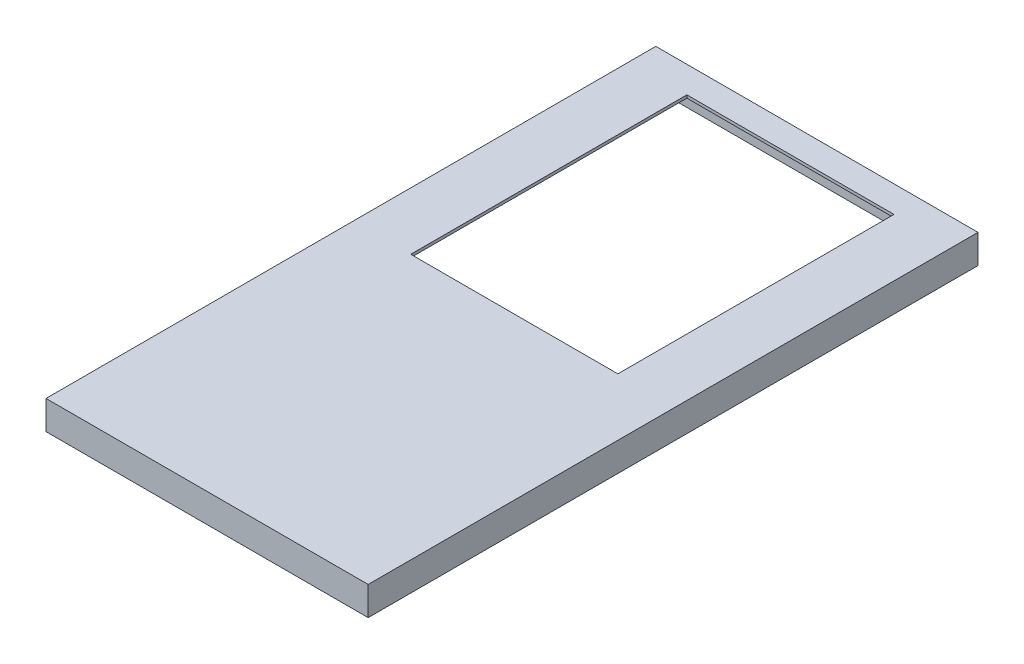
ISO-10303-21;
HEADER;
FILE_DESCRIPTION(('STEP AP214'),'2;1');
FILE_NAME('part.step','',(''),(''),'','','');
FILE_SCHEMA(('AUTOMOTIVE_DESIGN { 1 0 10303 214 1 1 1 1 }'));
ENDSEC;
DATA;
#1=APPLICATION_CONTEXT('core data for automotive mechanical design processes');
#2=APPLICATION_PROTOCOL_DEFINITION('international standard','automotive_design',2000,#1);
#3=PRODUCT_CONTEXT('',#1,'mechanical');
#4=PRODUCT('Part','Part','',(#3));
#5=PRODUCT_RELATED_PRODUCT_CATEGORY('part','',(#4));
#6=PRODUCT_DEFINITION_FORMATION('','',#4);
#7=PRODUCT_DEFINITION_CONTEXT('part definition',#1,'design');
#8=PRODUCT_DEFINITION('design','',#6,#7);
#9=PRODUCT_DEFINITION_SHAPE('','',#8);
#10=(LENGTH_UNIT() NAMED_UNIT(*) SI_UNIT(.MILLI.,.METRE.));
#11=(NAMED_UNIT(*) PLANE_ANGLE_UNIT() SI_UNIT($,.RADIAN.));
#12=(NAMED_UNIT(*) SI_UNIT($,.STERADIAN.) SOLID_ANGLE_UNIT());
#13=UNCERTAINTY_MEASURE_WITH_UNIT(LENGTH_MEASURE(1.E-05),#10,'distance_accuracy_value','');
#14=(GEOMETRIC_REPRESENTATION_CONTEXT(3) GLOBAL_UNCERTAINTY_ASSIGNED_CONTEXT((#13)) GLOBAL_UNIT_ASSIGNED_CONTEXT((#10,
#11,#12)) REPRESENTATION_CONTEXT('',''));
#15=CARTESIAN_POINT('',(0.,0.,0.));
#16=DIRECTION('',(0.,0.,1.));
#17=DIRECTION('',(1.,0.,0.));
#18=AXIS2_PLACEMENT_3D('',#15,#16,#17);
#19=CARTESIAN_POINT('',(-28.,-5.,51.5));
#20=DIRECTION('',(0.,0.,1.));
#21=DIRECTION('',(1.,0.,0.));
#22=AXIS2_PLACEMENT_3D('',#19,#20,#21);
#23=PLANE('',#22);
#24=DIRECTION('',(0.,1.,0.));
#25=VECTOR('',#24,1.);
#26=CARTESIAN_POINT('',(-22.8005102572168,-5.,51.5));
#27=LINE('',#26,#25);
#28=CARTESIAN_POINT('',(-22.8005102572168,-0.5,51.5));
#29=VERTEX_POINT('',#28);
#30=CARTESIAN_POINT('',(-22.8005102572168,-5.,51.5));
#31=VERTEX_POINT('',#30);
#32=EDGE_CURVE('E350',#29,#31,#27,.F.);
#33=ORIENTED_EDGE('',*,*,#32,.F.);
#34=DIRECTION('',(1.,0.,0.));
#35=VECTOR('',#34,1.);
#36=CARTESIAN_POINT('',(-28.,-0.5,51.5));
#37=LINE('',#36,#35);
#38=CARTESIAN_POINT('',(22.8005102572168,-0.5,51.5));
#39=VERTEX_POINT('',#38);
#40=EDGE_CURVE('E252',#29,#39,#37,.T.);
#41=ORIENTED_EDGE('',*,*,#40,.T.);
#42=DIRECTION('',(0.,1.,0.));
#43=VECTOR('',#42,1.);
#44=CARTESIAN_POINT('',(22.8005102572168,-5.,51.5));
#45=LINE('',#44,#43);
#46=CARTESIAN_POINT('',(22.8005102572168,-5.,51.5));
#47=VERTEX_POINT('',#46);
#48=EDGE_CURVE('E340',#39,#47,#45,.F.);
#49=ORIENTED_EDGE('',*,*,#48,.T.);
#50=DIRECTION('',(1.,0.,0.));
#51=VECTOR('',#50,1.);
#52=CARTESIAN_POINT('',(-28.,-5.,51.5));
#53=LINE('',#52,#51);
#54=EDGE_CURVE('E267',#31,#47,#53,.T.);
#55=ORIENTED_EDGE('',*,*,#54,.F.);
#56=EDGE_LOOP('',(#33,#41,#49,#55));
#57=FACE_BOUND('',#56,.T.);
#58=ADVANCED_FACE('F39',(#57),#23,.F.);
#59=CARTESIAN_POINT('',(-26.5,-5.,53.));
#60=DIRECTION('',(-1.,0.,0.));
#61=DIRECTION('',(0.,0.,1.));
#62=AXIS2_PLACEMENT_3D('',#59,#60,#61);
#63=PLANE('',#62);
#64=DIRECTION('',(0.,0.,1.));
#65=VECTOR('',#64,1.);
#66=CARTESIAN_POINT('',(-26.5,-5.,53.));
#67=LINE('',#66,#65);
#68=CARTESIAN_POINT('',(-26.5,-5.,-47.8005102572168));
#69=VERTEX_POINT('',#68);
#70=CARTESIAN_POINT('',(-26.5,-5.,47.8005102572168));
#71=VERTEX_POINT('',#70);
#72=EDGE_CURVE('E241',#69,#71,#67,.T.);
#73=ORIENTED_EDGE('',*,*,#72,.F.);
#74=DIRECTION('',(0.,1.,0.));
#75=VECTOR('',#74,1.);
#76=CARTESIAN_POINT('',(-26.5,-5.,-47.8005102572168));
#77=LINE('',#76,#75);
#78=CARTESIAN_POINT('',(-26.5,-0.5,-47.8005102572168));
#79=VERTEX_POINT('',#78);
#80=EDGE_CURVE('E225',#69,#79,#77,.T.);
#81=ORIENTED_EDGE('',*,*,#80,.T.);
#82=DIRECTION('',(0.,0.,1.));
#83=VECTOR('',#82,1.);
#84=CARTESIAN_POINT('',(-26.5,-0.5,53.));
#85=LINE('',#84,#83);
#86=CARTESIAN_POINT('',(-26.5,-0.5,47.8005102572168));
#87=VERTEX_POINT('',#86);
#88=EDGE_CURVE('E239',#79,#87,#85,.T.);
#89=ORIENTED_EDGE('',*,*,#88,.T.);
#90=DIRECTION('',(0.,1.,0.));
#91=VECTOR('',#90,1.);
#92=CARTESIAN_POINT('',(-26.5,-5.,47.8005102572168));
#93=LINE('',#92,#91);
#94=EDGE_CURVE('E48',#71,#87,#93,.T.);
#95=ORIENTED_EDGE('',*,*,#94,.F.);
#96=EDGE_LOOP('',(#73,#81,#89,#95));
#97=FACE_BOUND('',#96,.T.);
#98=ADVANCED_FACE('F237',(#97),#63,.F.);
#99=CARTESIAN_POINT('',(-28.,-5.,-51.5));
#100=DIRECTION('',(0.,0.,-1.));
#101=DIRECTION('',(-1.,0.,0.));
#102=AXIS2_PLACEMENT_3D('',#99,#100,#101);
#103=PLANE('',#102);
#104=DIRECTION('',(-1.,0.,0.));
#105=VECTOR('',#104,1.);
#106=CARTESIAN_POINT('',(-28.,-2.8,-51.5));
#107=LINE('',#106,#105);
#108=CARTESIAN_POINT('',(-21.6,-2.8,-51.5));
#109=VERTEX_POINT('',#108);
#110=CARTESIAN_POINT('',(-22.8005102572168,-2.8,-51.5));
#111=VERTEX_POINT('',#110);
#112=EDGE_CURVE('E332',#109,#111,#107,.T.);
#113=ORIENTED_EDGE('',*,*,#112,.T.);
#114=DIRECTION('',(0.,1.,0.));
#115=VECTOR('',#114,1.);
#116=CARTESIAN_POINT('',(-22.8005102572168,-5.,-51.5));
#117=LINE('',#116,#115);
#118=CARTESIAN_POINT('',(-22.8005102572168,-5.,-51.5));
#119=VERTEX_POINT('',#118);
#120=EDGE_CURVE('E244',#111,#119,#117,.F.);
#121=ORIENTED_EDGE('',*,*,#120,.T.);
#122=DIRECTION('',(-1.,0.,0.));
#123=VECTOR('',#122,1.);
#124=CARTESIAN_POINT('',(-28.,-5.,-51.5));
#125=LINE('',#124,#123);
#126=CARTESIAN_POINT('',(22.8005102572168,-5.,-51.5));
#127=VERTEX_POINT('',#126);
#128=EDGE_CURVE('E266',#127,#119,#125,.T.);
#129=ORIENTED_EDGE('',*,*,#128,.F.);
#130=DIRECTION('',(0.,1.,0.));
#131=VECTOR('',#130,1.);
#132=CARTESIAN_POINT('',(22.8005102572168,-5.,-51.5));
#133=LINE('',#132,#131);
#134=CARTESIAN_POINT('',(22.8005102572168,-2.8,-51.5));
#135=VERTEX_POINT('',#134);
#136=EDGE_CURVE('E400',#135,#127,#133,.F.);
#137=ORIENTED_EDGE('',*,*,#136,.F.);
#138=CARTESIAN_POINT('',(21.6,-2.8,-51.5));
#139=VERTEX_POINT('',#138);
#140=EDGE_CURVE('E336',#135,#139,#107,.T.);
#141=ORIENTED_EDGE('',*,*,#140,.T.);
#142=DIRECTION('',(0.,1.,0.));
#143=VECTOR('',#142,1.);
#144=CARTESIAN_POINT('',(21.6,-2.8,-51.5));
#145=LINE('',#144,#143);
#146=CARTESIAN_POINT('',(21.6,-0.5,-51.5));
#147=VERTEX_POINT('',#146);
#148=EDGE_CURVE('E499',#139,#147,#145,.T.);
#149=ORIENTED_EDGE('',*,*,#148,.T.);
#150=DIRECTION('',(-1.,0.,0.));
#151=VECTOR('',#150,1.);
#152=CARTESIAN_POINT('',(-28.,-0.5,-51.5));
#153=LINE('',#152,#151);
#154=CARTESIAN_POINT('',(-21.6,-0.5,-51.5));
#155=VERTEX_POINT('',#154);
#156=EDGE_CURVE('E253',#147,#155,#153,.T.);
#157=ORIENTED_EDGE('',*,*,#156,.T.);
#158=DIRECTION('',(0.,1.,0.));
#159=VECTOR('',#158,1.);
#160=CARTESIAN_POINT('',(-21.6,-2.8,-51.5));
#161=LINE('',#160,#159);
#162=EDGE_CURVE('E496',#109,#155,#161,.T.);
#163=ORIENTED_EDGE('',*,*,#162,.F.);
#164=EDGE_LOOP('',(#113,#121,#129,#137,#141,#149,#157,#163));
#165=FACE_BOUND('',#164,.T.);
#166=ADVANCED_FACE('F560',(#165),#103,.F.);
#167=CARTESIAN_POINT('',(26.5,-5.,53.));
#168=DIRECTION('',(1.,0.,0.));
#169=DIRECTION('',(0.,0.,-1.));
#170=AXIS2_PLACEMENT_3D('',#167,#168,#169);
#171=PLANE('',#170);
#172=DIRECTION('',(0.,0.,-1.));
#173=VECTOR('',#172,1.);
#174=CARTESIAN_POINT('',(26.5,-5.,53.));
#175=LINE('',#174,#173);
#176=CARTESIAN_POINT('',(26.5,-5.,47.8005102572168));
#177=VERTEX_POINT('',#176);
#178=CARTESIAN_POINT('',(26.5,-5.,-47.8005102572168));
#179=VERTEX_POINT('',#178);
#180=EDGE_CURVE('E257',#177,#179,#175,.T.);
#181=ORIENTED_EDGE('',*,*,#180,.F.);
#182=DIRECTION('',(0.,1.,0.));
#183=VECTOR('',#182,1.);
#184=CARTESIAN_POINT('',(26.5,-5.,47.8005102572168));
#185=LINE('',#184,#183);
#186=CARTESIAN_POINT('',(26.5,-0.5,47.8005102572168));
#187=VERTEX_POINT('',#186);
#188=EDGE_CURVE('E376',#177,#187,#185,.T.);
#189=ORIENTED_EDGE('',*,*,#188,.T.);
#190=DIRECTION('',(0.,0.,-1.));
#191=VECTOR('',#190,1.);
#192=CARTESIAN_POINT('',(26.5,-0.5,53.));
#193=LINE('',#192,#191);
#194=CARTESIAN_POINT('',(26.5,-0.5,-47.8005102572168));
#195=VERTEX_POINT('',#194);
#196=EDGE_CURVE('E260',#187,#195,#193,.T.);
#197=ORIENTED_EDGE('',*,*,#196,.T.);
#198=DIRECTION('',(0.,1.,0.));
#199=VECTOR('',#198,1.);
#200=CARTESIAN_POINT('',(26.5,-5.,-47.8005102572168));
#201=LINE('',#200,#199);
#202=EDGE_CURVE('E403',#179,#195,#201,.T.);
#203=ORIENTED_EDGE('',*,*,#202,.F.);
#204=EDGE_LOOP('',(#181,#189,#197,#203));
#205=FACE_BOUND('',#204,.T.);
#206=ADVANCED_FACE('F538',(#205),#171,.F.);
#207=CARTESIAN_POINT('',(23.1,-2.8,-53.));
#208=DIRECTION('',(-1.,0.,0.));
#209=DIRECTION('',(0.,0.,1.));
#210=AXIS2_PLACEMENT_3D('',#207,#208,#209);
#211=PLANE('',#210);
#212=DIRECTION('',(0.,1.,0.));
#213=VECTOR('',#212,1.);
#214=CARTESIAN_POINT('',(23.1,-5.,-48.5353571800518));
#215=LINE('',#214,#213);
#216=CARTESIAN_POINT('',(23.1,-0.5,-48.5353571800518));
#217=VERTEX_POINT('',#216);
#218=CARTESIAN_POINT('',(23.1,-2.8,-48.5353571800518));
#219=VERTEX_POINT('',#218);
#220=EDGE_CURVE('E62',#217,#219,#215,.F.);
#221=ORIENTED_EDGE('',*,*,#220,.F.);
#222=DIRECTION('',(0.,0.,-1.));
#223=VECTOR('',#222,1.);
#224=CARTESIAN_POINT('',(23.1,-0.5,0.));
#225=LINE('',#224,#223);
#226=CARTESIAN_POINT('',(23.1,-0.5,10.7));
#227=VERTEX_POINT('',#226);
#228=EDGE_CURVE('E328',#227,#217,#225,.T.);
#229=ORIENTED_EDGE('',*,*,#228,.F.);
#230=DIRECTION('',(0.,1.,0.));
#231=VECTOR('',#230,1.);
#232=CARTESIAN_POINT('',(23.1,-2.8,10.7));
#233=LINE('',#232,#231);
#234=CARTESIAN_POINT('',(23.1,-2.8,10.7));
#235=VERTEX_POINT('',#234);
#236=EDGE_CURVE('E477',#235,#227,#233,.T.);
#237=ORIENTED_EDGE('',*,*,#236,.F.);
#238=DIRECTION('',(0.,0.,1.));
#239=VECTOR('',#238,1.);
#240=CARTESIAN_POINT('',(23.1,-2.8,-53.));
#241=LINE('',#240,#239);
#242=EDGE_CURVE('E433',#219,#235,#241,.T.);
#243=ORIENTED_EDGE('',*,*,#242,.F.);
#244=EDGE_LOOP('',(#221,#229,#237,#243));
#245=FACE_BOUND('',#244,.T.);
#246=ADVANCED_FACE('F546',(#245),#211,.F.);
#247=CARTESIAN_POINT('',(0.,-0.5,0.));
#248=DIRECTION('',(0.,-1.,0.));
#249=DIRECTION('',(0.,0.,-1.));
#250=AXIS2_PLACEMENT_3D('',#247,#248,#249);
#251=PLANE('',#250);
#252=CARTESIAN_POINT('',(-25.25,-0.5,-50.25));
#253=DIRECTION('',(0.,1.,0.));
#254=DIRECTION('',(0.,0.,-1.));
#255=AXIS2_PLACEMENT_3D('',#252,#253,#254);
#256=CIRCLE('',#255,2.75);
#257=CARTESIAN_POINT('',(-23.1,-0.5,-48.5353571800518));
#258=VERTEX_POINT('',#257);
#259=EDGE_CURVE('E222',#79,#258,#256,.T.);
#260=ORIENTED_EDGE('',*,*,#259,.T.);
#261=DIRECTION('',(0.,0.,-1.));
#262=VECTOR('',#261,1.);
#263=CARTESIAN_POINT('',(-23.1,-0.5,-53.));
#264=LINE('',#263,#262);
#265=CARTESIAN_POINT('',(-23.1,-0.5,10.7));
#266=VERTEX_POINT('',#265);
#267=EDGE_CURVE('E462',#266,#258,#264,.T.);
#268=ORIENTED_EDGE('',*,*,#267,.F.);
#269=DIRECTION('',(-1.,0.,0.));
#270=VECTOR('',#269,1.);
#271=CARTESIAN_POINT('',(-23.1,-0.5,10.7));
#272=LINE('',#271,#270);
#273=CARTESIAN_POINT('',(-18.1,-0.5,10.7));
#274=VERTEX_POINT('',#273);
#275=EDGE_CURVE('E458',#274,#266,#272,.T.);
#276=ORIENTED_EDGE('',*,*,#275,.F.);
#277=DIRECTION('',(0.,0.,1.));
#278=VECTOR('',#277,1.);
#279=CARTESIAN_POINT('',(-18.1,-0.5,9.20000000000001));
#280=LINE('',#279,#278);
#281=CARTESIAN_POINT('',(-18.1,-0.5,9.20000000000001));
#282=VERTEX_POINT('',#281);
#283=EDGE_CURVE('E455',#282,#274,#280,.T.);
#284=ORIENTED_EDGE('',*,*,#283,.F.);
#285=DIRECTION('',(1.,0.,0.));
#286=VECTOR('',#285,1.);
#287=CARTESIAN_POINT('',(-21.6,-0.5,9.20000000000001));
#288=LINE('',#287,#286);
#289=CARTESIAN_POINT('',(-21.6,-0.5,9.20000000000001));
#290=VERTEX_POINT('',#289);
#291=EDGE_CURVE('E452',#290,#282,#288,.T.);
#292=ORIENTED_EDGE('',*,*,#291,.F.);
#293=DIRECTION('',(0.,0.,1.));
#294=VECTOR('',#293,1.);
#295=CARTESIAN_POINT('',(-21.6,-0.5,-51.5));
#296=LINE('',#295,#294);
#297=EDGE_CURVE('E449',#155,#290,#296,.T.);
#298=ORIENTED_EDGE('',*,*,#297,.F.);
#299=ORIENTED_EDGE('',*,*,#156,.F.);
#300=DIRECTION('',(0.,0.,-1.));
#301=VECTOR('',#300,1.);
#302=CARTESIAN_POINT('',(21.6,-0.5,-51.5));
#303=LINE('',#302,#301);
#304=CARTESIAN_POINT('',(21.6,-0.5,9.20000000000001));
#305=VERTEX_POINT('',#304);
#306=EDGE_CURVE('E446',#305,#147,#303,.T.);
#307=ORIENTED_EDGE('',*,*,#306,.F.);
#308=DIRECTION('',(1.,0.,0.));
#309=VECTOR('',#308,1.);
#310=CARTESIAN_POINT('',(18.1,-0.5,9.20000000000001));
#311=LINE('',#310,#309);
#312=CARTESIAN_POINT('',(18.1,-0.5,9.20000000000001));
#313=VERTEX_POINT('',#312);
#314=EDGE_CURVE('E407',#313,#305,#311,.T.);
#315=ORIENTED_EDGE('',*,*,#314,.F.);
#316=DIRECTION('',(0.,0.,-1.));
#317=VECTOR('',#316,1.);
#318=CARTESIAN_POINT('',(18.1,-0.5,10.7));
#319=LINE('',#318,#317);
#320=CARTESIAN_POINT('',(18.1,-0.5,10.7));
#321=VERTEX_POINT('',#320);
#322=EDGE_CURVE('E413',#321,#313,#319,.T.);
#323=ORIENTED_EDGE('',*,*,#322,.F.);
#324=DIRECTION('',(-1.,0.,0.));
#325=VECTOR('',#324,1.);
#326=CARTESIAN_POINT('',(18.1,-0.5,10.7));
#327=LINE('',#326,#325);
#328=EDGE_CURVE('E465',#227,#321,#327,.T.);
#329=ORIENTED_EDGE('',*,*,#328,.F.);
#330=ORIENTED_EDGE('',*,*,#228,.T.);
#331=CARTESIAN_POINT('',(25.25,-0.5,-50.25));
#332=DIRECTION('',(0.,-1.,0.));
#333=DIRECTION('',(0.,0.,-1.));
#334=AXIS2_PLACEMENT_3D('',#331,#332,#333);
#335=CIRCLE('',#334,2.75);
#336=EDGE_CURVE('E388',#195,#217,#335,.T.);
#337=ORIENTED_EDGE('',*,*,#336,.F.);
#338=ORIENTED_EDGE('',*,*,#196,.F.);
#339=CARTESIAN_POINT('',(25.25,-0.5,50.25));
#340=DIRECTION('',(0.,1.,0.));
#341=DIRECTION('',(0.,0.,1.));
#342=AXIS2_PLACEMENT_3D('',#339,#340,#341);
#343=CIRCLE('',#342,2.75);
#344=EDGE_CURVE('E368',#187,#39,#343,.T.);
#345=ORIENTED_EDGE('',*,*,#344,.T.);
#346=ORIENTED_EDGE('',*,*,#40,.F.);
#347=CARTESIAN_POINT('',(-25.25,-0.5,50.25));
#348=DIRECTION('',(0.,-1.,0.));
#349=DIRECTION('',(0.,0.,1.));
#350=AXIS2_PLACEMENT_3D('',#347,#348,#349);
#351=CIRCLE('',#350,2.75);
#352=EDGE_CURVE('E250',#87,#29,#351,.T.);
#353=ORIENTED_EDGE('',*,*,#352,.F.);
#354=ORIENTED_EDGE('',*,*,#88,.F.);
#355=EDGE_LOOP('',(#260,#268,#276,#284,#292,#298,#299,#307,#315,#323,#329,#330,#337,#338,#345,
#346,#353,#354));
#356=FACE_BOUND('',#355,.T.);
#357=DIRECTION('',(0.,0.,1.));
#358=VECTOR('',#357,1.);
#359=CARTESIAN_POINT('',(18.,-0.5,0.));
#360=LINE('',#359,#358);
#361=CARTESIAN_POINT('',(18.,-0.5,-48.4));
#362=VERTEX_POINT('',#361);
#363=CARTESIAN_POINT('',(18.,-0.5,-0.399999999999998));
#364=VERTEX_POINT('',#363);
#365=EDGE_CURVE('E325',#362,#364,#360,.T.);
#366=ORIENTED_EDGE('',*,*,#365,.F.);
#367=DIRECTION('',(1.,0.,0.));
#368=VECTOR('',#367,1.);
#369=CARTESIAN_POINT('',(0.,-0.5,-48.4));
#370=LINE('',#369,#368);
#371=CARTESIAN_POINT('',(-18.,-0.5,-48.4));
#372=VERTEX_POINT('',#371);
#373=EDGE_CURVE('E307',#372,#362,#370,.T.);
#374=ORIENTED_EDGE('',*,*,#373,.F.);
#375=DIRECTION('',(0.,0.,-1.));
#376=VECTOR('',#375,1.);
#377=CARTESIAN_POINT('',(-18.,-0.5,0.));
#378=LINE('',#377,#376);
#379=CARTESIAN_POINT('',(-18.,-0.5,-0.399999999999998));
#380=VERTEX_POINT('',#379);
#381=EDGE_CURVE('E318',#380,#372,#378,.T.);
#382=ORIENTED_EDGE('',*,*,#381,.F.);
#383=DIRECTION('',(-1.,0.,0.));
#384=VECTOR('',#383,1.);
#385=CARTESIAN_POINT('',(0.,-0.5,-0.399999999999998));
#386=LINE('',#385,#384);
#387=EDGE_CURVE('E322',#364,#380,#386,.T.);
#388=ORIENTED_EDGE('',*,*,#387,.F.);
#389=EDGE_LOOP('',(#366,#374,#382,#388));
#390=FACE_BOUND('',#389,.T.);
#391=ADVANCED_FACE('F247',(#356,#390),#251,.T.);
#392=CARTESIAN_POINT('',(0.,-5.,0.));
#393=DIRECTION('',(0.,-1.,0.));
#394=DIRECTION('',(0.,0.,-1.));
#395=AXIS2_PLACEMENT_3D('',#392,#393,#394);
#396=PLANE('',#395);
#397=CARTESIAN_POINT('',(-25.25,-5.,-50.25));
#398=DIRECTION('',(0.,1.,0.));
#399=DIRECTION('',(0.,0.,-1.));
#400=AXIS2_PLACEMENT_3D('',#397,#398,#399);
#401=CIRCLE('',#400,1.8);
#402=CARTESIAN_POINT('',(-25.25,-5.,-52.05));
#403=VERTEX_POINT('',#402);
#404=EDGE_CURVE('E1004',#403,#403,#401,.T.);
#405=ORIENTED_EDGE('',*,*,#404,.T.);
#406=EDGE_LOOP('',(#405));
#407=FACE_BOUND('',#406,.T.);
#408=CARTESIAN_POINT('',(-25.25,-5.,-50.25));
#409=DIRECTION('',(0.,1.,0.));
#410=DIRECTION('',(0.,0.,-1.));
#411=AXIS2_PLACEMENT_3D('',#408,#409,#410);
#412=CIRCLE('',#411,2.75);
#413=EDGE_CURVE('E232',#69,#119,#412,.T.);
#414=ORIENTED_EDGE('',*,*,#413,.F.);
#415=ORIENTED_EDGE('',*,*,#72,.T.);
#416=CARTESIAN_POINT('',(-25.25,-5.,50.25));
#417=DIRECTION('',(0.,-1.,0.));
#418=DIRECTION('',(0.,0.,1.));
#419=AXIS2_PLACEMENT_3D('',#416,#417,#418);
#420=CIRCLE('',#419,2.75);
#421=EDGE_CURVE('E349',#71,#31,#420,.T.);
#422=ORIENTED_EDGE('',*,*,#421,.T.);
#423=ORIENTED_EDGE('',*,*,#54,.T.);
#424=CARTESIAN_POINT('',(25.25,-5.,50.25));
#425=DIRECTION('',(0.,1.,0.));
#426=DIRECTION('',(0.,0.,1.));
#427=AXIS2_PLACEMENT_3D('',#424,#425,#426);
#428=CIRCLE('',#427,2.75);
#429=EDGE_CURVE('E372',#177,#47,#428,.T.);
#430=ORIENTED_EDGE('',*,*,#429,.F.);
#431=ORIENTED_EDGE('',*,*,#180,.T.);
#432=CARTESIAN_POINT('',(25.25,-5.,-50.25));
#433=DIRECTION('',(0.,-1.,0.));
#434=DIRECTION('',(0.,0.,-1.));
#435=AXIS2_PLACEMENT_3D('',#432,#433,#434);
#436=CIRCLE('',#435,2.75);
#437=EDGE_CURVE('E392',#179,#127,#436,.T.);
#438=ORIENTED_EDGE('',*,*,#437,.T.);
#439=ORIENTED_EDGE('',*,*,#128,.T.);
#440=EDGE_LOOP('',(#414,#415,#422,#423,#430,#431,#438,#439));
#441=FACE_BOUND('',#440,.T.);
#442=DIRECTION('',(0.,0.,1.));
#443=VECTOR('',#442,1.);
#444=CARTESIAN_POINT('',(-28.,-5.,53.));
#445=LINE('',#444,#443);
#446=CARTESIAN_POINT('',(-28.,-5.,-53.));
#447=VERTEX_POINT('',#446);
#448=CARTESIAN_POINT('',(-28.,-5.,53.));
#449=VERTEX_POINT('',#448);
#450=EDGE_CURVE('E283',#447,#449,#445,.T.);
#451=ORIENTED_EDGE('',*,*,#450,.F.);
#452=DIRECTION('',(-1.,0.,0.));
#453=VECTOR('',#452,1.);
#454=CARTESIAN_POINT('',(-28.,-5.,-53.));
#455=LINE('',#454,#453);
#456=CARTESIAN_POINT('',(28.,-5.,-53.));
#457=VERTEX_POINT('',#456);
#458=EDGE_CURVE('E279',#457,#447,#455,.T.);
#459=ORIENTED_EDGE('',*,*,#458,.F.);
#460=DIRECTION('',(0.,0.,-1.));
#461=VECTOR('',#460,1.);
#462=CARTESIAN_POINT('',(28.,-5.,53.));
#463=LINE('',#462,#461);
#464=CARTESIAN_POINT('',(28.,-5.,53.));
#465=VERTEX_POINT('',#464);
#466=EDGE_CURVE('E276',#465,#457,#463,.T.);
#467=ORIENTED_EDGE('',*,*,#466,.F.);
#468=DIRECTION('',(1.,0.,0.));
#469=VECTOR('',#468,1.);
#470=CARTESIAN_POINT('',(-28.,-5.,53.));
#471=LINE('',#470,#469);
#472=EDGE_CURVE('E286',#449,#465,#471,.T.);
#473=ORIENTED_EDGE('',*,*,#472,.F.);
#474=EDGE_LOOP('',(#451,#459,#467,#473));
#475=FACE_BOUND('',#474,.T.);
#476=CARTESIAN_POINT('',(-25.25,-5.,50.25));
#477=DIRECTION('',(0.,-1.,0.));
#478=DIRECTION('',(0.,0.,1.));
#479=AXIS2_PLACEMENT_3D('',#476,#477,#478);
#480=CIRCLE('',#479,1.8);
#481=CARTESIAN_POINT('',(-25.25,-5.,52.05));
#482=VERTEX_POINT('',#481);
#483=EDGE_CURVE('E243',#482,#482,#480,.T.);
#484=ORIENTED_EDGE('',*,*,#483,.F.);
#485=EDGE_LOOP('',(#484));
#486=FACE_BOUND('',#485,.T.);
#487=CARTESIAN_POINT('',(25.25,-5.,-50.25));
#488=DIRECTION('',(0.,-1.,0.));
#489=DIRECTION('',(0.,0.,-1.));
#490=AXIS2_PLACEMENT_3D('',#487,#488,#489);
#491=CIRCLE('',#490,1.8);
#492=CARTESIAN_POINT('',(25.25,-5.,-52.05));
#493=VERTEX_POINT('',#492);
#494=EDGE_CURVE('E383',#493,#493,#491,.T.);
#495=ORIENTED_EDGE('',*,*,#494,.F.);
#496=EDGE_LOOP('',(#495));
#497=FACE_BOUND('',#496,.T.);
#498=CARTESIAN_POINT('',(25.25,-5.,50.25));
#499=DIRECTION('',(0.,1.,0.));
#500=DIRECTION('',(0.,0.,1.));
#501=AXIS2_PLACEMENT_3D('',#498,#499,#500);
#502=CIRCLE('',#501,1.8);
#503=CARTESIAN_POINT('',(25.25,-5.,52.05));
#504=VERTEX_POINT('',#503);
#505=EDGE_CURVE('E357',#504,#504,#502,.T.);
#506=ORIENTED_EDGE('',*,*,#505,.T.);
#507=EDGE_LOOP('',(#506));
#508=FACE_BOUND('',#507,.T.);
#509=ADVANCED_FACE('F562',(#407,#441,#475,#486,#497,#508),#396,.T.);
#510=CARTESIAN_POINT('',(28.,-5.,53.));
#511=DIRECTION('',(1.,0.,0.));
#512=DIRECTION('',(0.,0.,-1.));
#513=AXIS2_PLACEMENT_3D('',#510,#511,#512);
#514=PLANE('',#513);
#515=ORIENTED_EDGE('',*,*,#466,.T.);
#516=DIRECTION('',(0.,1.,0.));
#517=VECTOR('',#516,1.);
#518=CARTESIAN_POINT('',(28.,-5.,-53.));
#519=LINE('',#518,#517);
#520=CARTESIAN_POINT('',(28.,0.,-53.));
#521=VERTEX_POINT('',#520);
#522=EDGE_CURVE('E289',#457,#521,#519,.T.);
#523=ORIENTED_EDGE('',*,*,#522,.T.);
#524=DIRECTION('',(0.,0.,-1.));
#525=VECTOR('',#524,1.);
#526=CARTESIAN_POINT('',(28.,0.,53.));
#527=LINE('',#526,#525);
#528=CARTESIAN_POINT('',(28.,0.,53.));
#529=VERTEX_POINT('',#528);
#530=EDGE_CURVE('E270',#529,#521,#527,.T.);
#531=ORIENTED_EDGE('',*,*,#530,.F.);
#532=DIRECTION('',(0.,1.,0.));
#533=VECTOR('',#532,1.);
#534=CARTESIAN_POINT('',(28.,-5.,53.));
#535=LINE('',#534,#533);
#536=EDGE_CURVE('E304',#465,#529,#535,.T.);
#537=ORIENTED_EDGE('',*,*,#536,.F.);
#538=EDGE_LOOP('',(#515,#523,#531,#537));
#539=FACE_BOUND('',#538,.T.);
#540=ADVANCED_FACE('F41',(#539),#514,.T.);
#541=CARTESIAN_POINT('',(-28.,-5.,53.));
#542=DIRECTION('',(0.,0.,1.));
#543=DIRECTION('',(1.,0.,0.));
#544=AXIS2_PLACEMENT_3D('',#541,#542,#543);
#545=PLANE('',#544);
#546=ORIENTED_EDGE('',*,*,#472,.T.);
#547=ORIENTED_EDGE('',*,*,#536,.T.);
#548=DIRECTION('',(1.,0.,0.));
#549=VECTOR('',#548,1.);
#550=CARTESIAN_POINT('',(-28.,0.,53.));
#551=LINE('',#550,#549);
#552=CARTESIAN_POINT('',(-28.,0.,53.));
#553=VERTEX_POINT('',#552);
#554=EDGE_CURVE('E280',#553,#529,#551,.T.);
#555=ORIENTED_EDGE('',*,*,#554,.F.);
#556=DIRECTION('',(0.,1.,0.));
#557=VECTOR('',#556,1.);
#558=CARTESIAN_POINT('',(-28.,-5.,53.));
#559=LINE('',#558,#557);
#560=EDGE_CURVE('E308',#449,#553,#559,.T.);
#561=ORIENTED_EDGE('',*,*,#560,.F.);
#562=EDGE_LOOP('',(#546,#547,#555,#561));
#563=FACE_BOUND('',#562,.T.);
#564=ADVANCED_FACE('F591',(#563),#545,.T.);
#565=CARTESIAN_POINT('',(-28.,-5.,53.));
#566=DIRECTION('',(-1.,0.,0.));
#567=DIRECTION('',(0.,0.,1.));
#568=AXIS2_PLACEMENT_3D('',#565,#566,#567);
#569=PLANE('',#568);
#570=ORIENTED_EDGE('',*,*,#450,.T.);
#571=ORIENTED_EDGE('',*,*,#560,.T.);
#572=DIRECTION('',(0.,0.,1.));
#573=VECTOR('',#572,1.);
#574=CARTESIAN_POINT('',(-28.,0.,53.));
#575=LINE('',#574,#573);
#576=CARTESIAN_POINT('',(-28.,0.,-53.));
#577=VERTEX_POINT('',#576);
#578=EDGE_CURVE('E297',#577,#553,#575,.T.);
#579=ORIENTED_EDGE('',*,*,#578,.F.);
#580=DIRECTION('',(0.,1.,0.));
#581=VECTOR('',#580,1.);
#582=CARTESIAN_POINT('',(-28.,-5.,-53.));
#583=LINE('',#582,#581);
#584=EDGE_CURVE('E311',#447,#577,#583,.T.);
#585=ORIENTED_EDGE('',*,*,#584,.F.);
#586=EDGE_LOOP('',(#570,#571,#579,#585));
#587=FACE_BOUND('',#586,.T.);
#588=ADVANCED_FACE('F594',(#587),#569,.T.);
#589=CARTESIAN_POINT('',(-28.,-5.,-53.));
#590=DIRECTION('',(0.,0.,-1.));
#591=DIRECTION('',(-1.,0.,0.));
#592=AXIS2_PLACEMENT_3D('',#589,#590,#591);
#593=PLANE('',#592);
#594=ORIENTED_EDGE('',*,*,#458,.T.);
#595=ORIENTED_EDGE('',*,*,#584,.T.);
#596=DIRECTION('',(-1.,0.,0.));
#597=VECTOR('',#596,1.);
#598=CARTESIAN_POINT('',(-28.,0.,-53.));
#599=LINE('',#598,#597);
#600=EDGE_CURVE('E293',#521,#577,#599,.T.);
#601=ORIENTED_EDGE('',*,*,#600,.F.);
#602=ORIENTED_EDGE('',*,*,#522,.F.);
#603=EDGE_LOOP('',(#594,#595,#601,#602));
#604=FACE_BOUND('',#603,.T.);
#605=ADVANCED_FACE('F589',(#604),#593,.T.);
#606=CARTESIAN_POINT('',(0.,0.,0.));
#607=DIRECTION('',(0.,-1.,0.));
#608=DIRECTION('',(0.,0.,-1.));
#609=AXIS2_PLACEMENT_3D('',#606,#607,#608);
#610=PLANE('',#609);
#611=DIRECTION('',(-1.,0.,0.));
#612=VECTOR('',#611,1.);
#613=CARTESIAN_POINT('',(-18.,0.,-48.4));
#614=LINE('',#613,#612);
#615=CARTESIAN_POINT('',(18.,0.,-48.4));
#616=VERTEX_POINT('',#615);
#617=CARTESIAN_POINT('',(-18.,0.,-48.4));
#618=VERTEX_POINT('',#617);
#619=EDGE_CURVE('E509',#616,#618,#614,.T.);
#620=ORIENTED_EDGE('',*,*,#619,.F.);
#621=DIRECTION('',(0.,0.,-1.));
#622=VECTOR('',#621,1.);
#623=CARTESIAN_POINT('',(18.,0.,-48.4));
#624=LINE('',#623,#622);
#625=CARTESIAN_POINT('',(18.,0.,-0.399999999999998));
#626=VERTEX_POINT('',#625);
#627=EDGE_CURVE('E506',#626,#616,#624,.T.);
#628=ORIENTED_EDGE('',*,*,#627,.F.);
#629=DIRECTION('',(1.,0.,0.));
#630=VECTOR('',#629,1.);
#631=CARTESIAN_POINT('',(-18.,0.,-0.399999999999998));
#632=LINE('',#631,#630);
#633=CARTESIAN_POINT('',(-18.,0.,-0.399999999999998));
#634=VERTEX_POINT('',#633);
#635=EDGE_CURVE('E517',#634,#626,#632,.T.);
#636=ORIENTED_EDGE('',*,*,#635,.F.);
#637=DIRECTION('',(0.,0.,1.));
#638=VECTOR('',#637,1.);
#639=CARTESIAN_POINT('',(-18.,0.,-48.4));
#640=LINE('',#639,#638);
#641=EDGE_CURVE('E513',#618,#634,#640,.T.);
#642=ORIENTED_EDGE('',*,*,#641,.F.);
#643=EDGE_LOOP('',(#620,#628,#636,#642));
#644=FACE_BOUND('',#643,.T.);
#645=ORIENTED_EDGE('',*,*,#530,.T.);
#646=ORIENTED_EDGE('',*,*,#600,.T.);
#647=ORIENTED_EDGE('',*,*,#578,.T.);
#648=ORIENTED_EDGE('',*,*,#554,.T.);
#649=EDGE_LOOP('',(#645,#646,#647,#648));
#650=FACE_BOUND('',#649,.T.);
#651=ADVANCED_FACE('F585',(#644,#650),#610,.F.);
#652=CARTESIAN_POINT('',(18.,-5.,-48.4));
#653=DIRECTION('',(1.,0.,0.));
#654=DIRECTION('',(0.,0.,-1.));
#655=AXIS2_PLACEMENT_3D('',#652,#653,#654);
#656=PLANE('',#655);
#657=ORIENTED_EDGE('',*,*,#365,.T.);
#658=DIRECTION('',(0.,1.,0.));
#659=VECTOR('',#658,1.);
#660=CARTESIAN_POINT('',(18.,-5.,-0.399999999999998));
#661=LINE('',#660,#659);
#662=EDGE_CURVE('E522',#364,#626,#661,.T.);
#663=ORIENTED_EDGE('',*,*,#662,.T.);
#664=ORIENTED_EDGE('',*,*,#627,.T.);
#665=DIRECTION('',(0.,1.,0.));
#666=VECTOR('',#665,1.);
#667=CARTESIAN_POINT('',(18.,-5.,-48.4));
#668=LINE('',#667,#666);
#669=EDGE_CURVE('E521',#362,#616,#668,.T.);
#670=ORIENTED_EDGE('',*,*,#669,.F.);
#671=EDGE_LOOP('',(#657,#663,#664,#670));
#672=FACE_BOUND('',#671,.T.);
#673=ADVANCED_FACE('F588',(#672),#656,.F.);
#674=CARTESIAN_POINT('',(-18.,-5.,-0.399999999999998));
#675=DIRECTION('',(0.,0.,1.));
#676=DIRECTION('',(1.,0.,0.));
#677=AXIS2_PLACEMENT_3D('',#674,#675,#676);
#678=PLANE('',#677);
#679=ORIENTED_EDGE('',*,*,#387,.T.);
#680=DIRECTION('',(0.,1.,0.));
#681=VECTOR('',#680,1.);
#682=CARTESIAN_POINT('',(-18.,-5.,-0.399999999999998));
#683=LINE('',#682,#681);
#684=EDGE_CURVE('E525',#380,#634,#683,.T.);
#685=ORIENTED_EDGE('',*,*,#684,.T.);
#686=ORIENTED_EDGE('',*,*,#635,.T.);
#687=ORIENTED_EDGE('',*,*,#662,.F.);
#688=EDGE_LOOP('',(#679,#685,#686,#687));
#689=FACE_BOUND('',#688,.T.);
#690=ADVANCED_FACE('F777',(#689),#678,.F.);
#691=CARTESIAN_POINT('',(-18.,-5.,-48.4));
#692=DIRECTION('',(-1.,0.,0.));
#693=DIRECTION('',(0.,0.,1.));
#694=AXIS2_PLACEMENT_3D('',#691,#692,#693);
#695=PLANE('',#694);
#696=ORIENTED_EDGE('',*,*,#381,.T.);
#697=DIRECTION('',(0.,1.,0.));
#698=VECTOR('',#697,1.);
#699=CARTESIAN_POINT('',(-18.,-5.,-48.4));
#700=LINE('',#699,#698);
#701=EDGE_CURVE('E528',#372,#618,#700,.T.);
#702=ORIENTED_EDGE('',*,*,#701,.T.);
#703=ORIENTED_EDGE('',*,*,#641,.T.);
#704=ORIENTED_EDGE('',*,*,#684,.F.);
#705=EDGE_LOOP('',(#696,#702,#703,#704));
#706=FACE_BOUND('',#705,.T.);
#707=ADVANCED_FACE('F780',(#706),#695,.F.);
#708=CARTESIAN_POINT('',(-18.,-5.,-48.4));
#709=DIRECTION('',(0.,0.,-1.));
#710=DIRECTION('',(-1.,0.,0.));
#711=AXIS2_PLACEMENT_3D('',#708,#709,#710);
#712=PLANE('',#711);
#713=ORIENTED_EDGE('',*,*,#373,.T.);
#714=ORIENTED_EDGE('',*,*,#669,.T.);
#715=ORIENTED_EDGE('',*,*,#619,.T.);
#716=ORIENTED_EDGE('',*,*,#701,.F.);
#717=EDGE_LOOP('',(#713,#714,#715,#716));
#718=FACE_BOUND('',#717,.T.);
#719=ADVANCED_FACE('F751',(#718),#712,.F.);
#720=CARTESIAN_POINT('',(18.1,-2.8,10.7));
#721=DIRECTION('',(1.,0.,0.));
#722=DIRECTION('',(0.,0.,-1.));
#723=AXIS2_PLACEMENT_3D('',#720,#721,#722);
#724=PLANE('',#723);
#725=ORIENTED_EDGE('',*,*,#322,.T.);
#726=DIRECTION('',(0.,1.,0.));
#727=VECTOR('',#726,1.);
#728=CARTESIAN_POINT('',(18.1,-2.8,9.20000000000001));
#729=LINE('',#728,#727);
#730=CARTESIAN_POINT('',(18.1,-2.8,9.20000000000001));
#731=VERTEX_POINT('',#730);
#732=EDGE_CURVE('E442',#731,#313,#729,.T.);
#733=ORIENTED_EDGE('',*,*,#732,.F.);
#734=DIRECTION('',(0.,0.,-1.));
#735=VECTOR('',#734,1.);
#736=CARTESIAN_POINT('',(18.1,-2.8,10.7));
#737=LINE('',#736,#735);
#738=CARTESIAN_POINT('',(18.1,-2.8,10.7));
#739=VERTEX_POINT('',#738);
#740=EDGE_CURVE('E439',#739,#731,#737,.T.);
#741=ORIENTED_EDGE('',*,*,#740,.F.);
#742=DIRECTION('',(0.,1.,0.));
#743=VECTOR('',#742,1.);
#744=CARTESIAN_POINT('',(18.1,-2.8,10.7));
#745=LINE('',#744,#743);
#746=EDGE_CURVE('E474',#739,#321,#745,.T.);
#747=ORIENTED_EDGE('',*,*,#746,.T.);
#748=EDGE_LOOP('',(#725,#733,#741,#747));
#749=FACE_BOUND('',#748,.T.);
#750=ADVANCED_FACE('F748',(#749),#724,.F.);
#751=CARTESIAN_POINT('',(18.1,-2.8,10.7));
#752=DIRECTION('',(0.,0.,-1.));
#753=DIRECTION('',(-1.,0.,0.));
#754=AXIS2_PLACEMENT_3D('',#751,#752,#753);
#755=PLANE('',#754);
#756=ORIENTED_EDGE('',*,*,#328,.T.);
#757=ORIENTED_EDGE('',*,*,#746,.F.);
#758=DIRECTION('',(-1.,0.,0.));
#759=VECTOR('',#758,1.);
#760=CARTESIAN_POINT('',(18.1,-2.8,10.7));
#761=LINE('',#760,#759);
#762=EDGE_CURVE('E436',#235,#739,#761,.T.);
#763=ORIENTED_EDGE('',*,*,#762,.F.);
#764=ORIENTED_EDGE('',*,*,#236,.T.);
#765=EDGE_LOOP('',(#756,#757,#763,#764));
#766=FACE_BOUND('',#765,.T.);
#767=ADVANCED_FACE('F550',(#766),#755,.F.);
#768=CARTESIAN_POINT('',(21.6,-2.8,-51.5));
#769=DIRECTION('',(1.,0.,0.));
#770=DIRECTION('',(0.,0.,-1.));
#771=AXIS2_PLACEMENT_3D('',#768,#769,#770);
#772=PLANE('',#771);
#773=ORIENTED_EDGE('',*,*,#306,.T.);
#774=ORIENTED_EDGE('',*,*,#148,.F.);
#775=DIRECTION('',(0.,0.,-1.));
#776=VECTOR('',#775,1.);
#777=CARTESIAN_POINT('',(21.6,-2.8,-51.5));
#778=LINE('',#777,#776);
#779=CARTESIAN_POINT('',(21.6,-2.8,9.20000000000001));
#780=VERTEX_POINT('',#779);
#781=EDGE_CURVE('E412',#780,#139,#778,.T.);
#782=ORIENTED_EDGE('',*,*,#781,.F.);
#783=DIRECTION('',(0.,1.,0.));
#784=VECTOR('',#783,1.);
#785=CARTESIAN_POINT('',(21.6,-2.8,9.20000000000001));
#786=LINE('',#785,#784);
#787=EDGE_CURVE('E503',#780,#305,#786,.T.);
#788=ORIENTED_EDGE('',*,*,#787,.T.);
#789=EDGE_LOOP('',(#773,#774,#782,#788));
#790=FACE_BOUND('',#789,.T.);
#791=ADVANCED_FACE('F755',(#790),#772,.F.);
#792=CARTESIAN_POINT('',(18.1,-2.8,9.20000000000001));
#793=DIRECTION('',(0.,0.,1.));
#794=DIRECTION('',(1.,0.,0.));
#795=AXIS2_PLACEMENT_3D('',#792,#793,#794);
#796=PLANE('',#795);
#797=ORIENTED_EDGE('',*,*,#314,.T.);
#798=ORIENTED_EDGE('',*,*,#787,.F.);
#799=DIRECTION('',(1.,0.,0.));
#800=VECTOR('',#799,1.);
#801=CARTESIAN_POINT('',(18.1,-2.8,9.20000000000001));
#802=LINE('',#801,#800);
#803=EDGE_CURVE('E408',#731,#780,#802,.T.);
#804=ORIENTED_EDGE('',*,*,#803,.F.);
#805=ORIENTED_EDGE('',*,*,#732,.T.);
#806=EDGE_LOOP('',(#797,#798,#804,#805));
#807=FACE_BOUND('',#806,.T.);
#808=ADVANCED_FACE('F747',(#807),#796,.F.);
#809=CARTESIAN_POINT('',(0.,-2.8,0.));
#810=DIRECTION('',(0.,-1.,0.));
#811=DIRECTION('',(0.,0.,-1.));
#812=AXIS2_PLACEMENT_3D('',#809,#810,#811);
#813=PLANE('',#812);
#814=ORIENTED_EDGE('',*,*,#140,.F.);
#815=CARTESIAN_POINT('',(25.25,-2.8,-50.25));
#816=DIRECTION('',(0.,-1.,0.));
#817=DIRECTION('',(0.,0.,-1.));
#818=AXIS2_PLACEMENT_3D('',#815,#816,#817);
#819=CIRCLE('',#818,2.75);
#820=EDGE_CURVE('E337',#135,#219,#819,.F.);
#821=ORIENTED_EDGE('',*,*,#820,.T.);
#822=ORIENTED_EDGE('',*,*,#242,.T.);
#823=ORIENTED_EDGE('',*,*,#762,.T.);
#824=ORIENTED_EDGE('',*,*,#740,.T.);
#825=ORIENTED_EDGE('',*,*,#803,.T.);
#826=ORIENTED_EDGE('',*,*,#781,.T.);
#827=EDGE_LOOP('',(#814,#821,#822,#823,#824,#825,#826));
#828=FACE_BOUND('',#827,.T.);
#829=ADVANCED_FACE('F555',(#828),#813,.T.);
#830=CARTESIAN_POINT('',(-25.25,-2.8,-50.25));
#831=DIRECTION('',(0.,-1.,0.));
#832=DIRECTION('',(0.,0.,-1.));
#833=AXIS2_PLACEMENT_3D('',#830,#831,#832);
#834=CIRCLE('',#833,2.75);
#835=CARTESIAN_POINT('',(-23.1,-2.8,-48.5353571800518));
#836=VERTEX_POINT('',#835);
#837=EDGE_CURVE('E55',#111,#836,#834,.T.);
#838=ORIENTED_EDGE('',*,*,#837,.F.);
#839=ORIENTED_EDGE('',*,*,#112,.F.);
#840=DIRECTION('',(0.,0.,1.));
#841=VECTOR('',#840,1.);
#842=CARTESIAN_POINT('',(-21.6,-2.8,-51.5));
#843=LINE('',#842,#841);
#844=CARTESIAN_POINT('',(-21.6,-2.8,9.20000000000001));
#845=VERTEX_POINT('',#844);
#846=EDGE_CURVE('E417',#109,#845,#843,.T.);
#847=ORIENTED_EDGE('',*,*,#846,.T.);
#848=DIRECTION('',(1.,0.,0.));
#849=VECTOR('',#848,1.);
#850=CARTESIAN_POINT('',(-21.6,-2.8,9.20000000000001));
#851=LINE('',#850,#849);
#852=CARTESIAN_POINT('',(-18.1,-2.8,9.20000000000001));
#853=VERTEX_POINT('',#852);
#854=EDGE_CURVE('E420',#845,#853,#851,.T.);
#855=ORIENTED_EDGE('',*,*,#854,.T.);
#856=DIRECTION('',(0.,0.,1.));
#857=VECTOR('',#856,1.);
#858=CARTESIAN_POINT('',(-18.1,-2.8,9.20000000000001));
#859=LINE('',#858,#857);
#860=CARTESIAN_POINT('',(-18.1,-2.8,10.7));
#861=VERTEX_POINT('',#860);
#862=EDGE_CURVE('E423',#853,#861,#859,.T.);
#863=ORIENTED_EDGE('',*,*,#862,.T.);
#864=DIRECTION('',(-1.,0.,0.));
#865=VECTOR('',#864,1.);
#866=CARTESIAN_POINT('',(-23.1,-2.8,10.7));
#867=LINE('',#866,#865);
#868=CARTESIAN_POINT('',(-23.1,-2.8,10.7));
#869=VERTEX_POINT('',#868);
#870=EDGE_CURVE('E426',#861,#869,#867,.T.);
#871=ORIENTED_EDGE('',*,*,#870,.T.);
#872=DIRECTION('',(0.,0.,-1.));
#873=VECTOR('',#872,1.);
#874=CARTESIAN_POINT('',(-23.1,-2.8,-53.));
#875=LINE('',#874,#873);
#876=EDGE_CURVE('E429',#869,#836,#875,.T.);
#877=ORIENTED_EDGE('',*,*,#876,.T.);
#878=EDGE_LOOP('',(#838,#839,#847,#855,#863,#871,#877));
#879=FACE_BOUND('',#878,.T.);
#880=ADVANCED_FACE('F642',(#879),#813,.T.);
#881=CARTESIAN_POINT('',(-23.1,-2.8,-53.));
#882=DIRECTION('',(1.,0.,0.));
#883=DIRECTION('',(0.,0.,-1.));
#884=AXIS2_PLACEMENT_3D('',#881,#882,#883);
#885=PLANE('',#884);
#886=ORIENTED_EDGE('',*,*,#267,.T.);
#887=DIRECTION('',(0.,1.,0.));
#888=VECTOR('',#887,1.);
#889=CARTESIAN_POINT('',(-23.1,-5.,-48.5353571800518));
#890=LINE('',#889,#888);
#891=EDGE_CURVE('E11',#258,#836,#890,.F.);
#892=ORIENTED_EDGE('',*,*,#891,.T.);
#893=ORIENTED_EDGE('',*,*,#876,.F.);
#894=DIRECTION('',(0.,1.,0.));
#895=VECTOR('',#894,1.);
#896=CARTESIAN_POINT('',(-23.1,-2.8,10.7));
#897=LINE('',#896,#895);
#898=EDGE_CURVE('E481',#869,#266,#897,.T.);
#899=ORIENTED_EDGE('',*,*,#898,.T.);
#900=EDGE_LOOP('',(#886,#892,#893,#899));
#901=FACE_BOUND('',#900,.T.);
#902=ADVANCED_FACE('F647',(#901),#885,.F.);
#903=CARTESIAN_POINT('',(-21.6,-2.8,-51.5));
#904=DIRECTION('',(-1.,0.,0.));
#905=DIRECTION('',(0.,0.,1.));
#906=AXIS2_PLACEMENT_3D('',#903,#904,#905);
#907=PLANE('',#906);
#908=ORIENTED_EDGE('',*,*,#297,.T.);
#909=DIRECTION('',(0.,1.,0.));
#910=VECTOR('',#909,1.);
#911=CARTESIAN_POINT('',(-21.6,-2.8,9.20000000000001));
#912=LINE('',#911,#910);
#913=EDGE_CURVE('E492',#845,#290,#912,.T.);
#914=ORIENTED_EDGE('',*,*,#913,.F.);
#915=ORIENTED_EDGE('',*,*,#846,.F.);
#916=ORIENTED_EDGE('',*,*,#162,.T.);
#917=EDGE_LOOP('',(#908,#914,#915,#916));
#918=FACE_BOUND('',#917,.T.);
#919=ADVANCED_FACE('F659',(#918),#907,.F.);
#920=CARTESIAN_POINT('',(-21.6,-2.8,9.20000000000001));
#921=DIRECTION('',(0.,0.,1.));
#922=DIRECTION('',(1.,0.,0.));
#923=AXIS2_PLACEMENT_3D('',#920,#921,#922);
#924=PLANE('',#923);
#925=ORIENTED_EDGE('',*,*,#291,.T.);
#926=DIRECTION('',(0.,1.,0.));
#927=VECTOR('',#926,1.);
#928=CARTESIAN_POINT('',(-18.1,-2.8,9.20000000000001));
#929=LINE('',#928,#927);
#930=EDGE_CURVE('E488',#853,#282,#929,.T.);
#931=ORIENTED_EDGE('',*,*,#930,.F.);
#932=ORIENTED_EDGE('',*,*,#854,.F.);
#933=ORIENTED_EDGE('',*,*,#913,.T.);
#934=EDGE_LOOP('',(#925,#931,#932,#933));
#935=FACE_BOUND('',#934,.T.);
#936=ADVANCED_FACE('F764',(#935),#924,.F.);
#937=CARTESIAN_POINT('',(-18.1,-2.8,9.20000000000001));
#938=DIRECTION('',(-1.,0.,0.));
#939=DIRECTION('',(0.,0.,1.));
#940=AXIS2_PLACEMENT_3D('',#937,#938,#939);
#941=PLANE('',#940);
#942=ORIENTED_EDGE('',*,*,#283,.T.);
#943=DIRECTION('',(0.,1.,0.));
#944=VECTOR('',#943,1.);
#945=CARTESIAN_POINT('',(-18.1,-2.8,10.7));
#946=LINE('',#945,#944);
#947=EDGE_CURVE('E484',#861,#274,#946,.T.);
#948=ORIENTED_EDGE('',*,*,#947,.F.);
#949=ORIENTED_EDGE('',*,*,#862,.F.);
#950=ORIENTED_EDGE('',*,*,#930,.T.);
#951=EDGE_LOOP('',(#942,#948,#949,#950));
#952=FACE_BOUND('',#951,.T.);
#953=ADVANCED_FACE('F760',(#952),#941,.F.);
#954=CARTESIAN_POINT('',(-23.1,-2.8,10.7));
#955=DIRECTION('',(0.,0.,-1.));
#956=DIRECTION('',(-1.,0.,0.));
#957=AXIS2_PLACEMENT_3D('',#954,#955,#956);
#958=PLANE('',#957);
#959=ORIENTED_EDGE('',*,*,#275,.T.);
#960=ORIENTED_EDGE('',*,*,#898,.F.);
#961=ORIENTED_EDGE('',*,*,#870,.F.);
#962=ORIENTED_EDGE('',*,*,#947,.T.);
#963=EDGE_LOOP('',(#959,#960,#961,#962));
#964=FACE_BOUND('',#963,.T.);
#965=ADVANCED_FACE('F745',(#964),#958,.F.);
#966=CARTESIAN_POINT('',(25.25,-5.,-50.25));
#967=DIRECTION('',(0.,1.,0.));
#968=DIRECTION('',(0.,0.,1.));
#969=AXIS2_PLACEMENT_3D('',#966,#967,#968);
#970=CYLINDRICAL_SURFACE('',#969,2.75);
#971=ORIENTED_EDGE('',*,*,#437,.F.);
#972=ORIENTED_EDGE('',*,*,#202,.T.);
#973=ORIENTED_EDGE('',*,*,#336,.T.);
#974=ORIENTED_EDGE('',*,*,#220,.T.);
#975=ORIENTED_EDGE('',*,*,#820,.F.);
#976=ORIENTED_EDGE('',*,*,#136,.T.);
#977=EDGE_LOOP('',(#971,#972,#973,#974,#975,#976));
#978=FACE_BOUND('',#977,.T.);
#979=ADVANCED_FACE('F541',(#978),#970,.T.);
#980=CARTESIAN_POINT('',(25.25,-0.5,-50.25));
#981=DIRECTION('',(0.,-1.,0.));
#982=DIRECTION('',(0.,0.,-1.));
#983=AXIS2_PLACEMENT_3D('',#980,#981,#982);
#984=CYLINDRICAL_SURFACE('',#983,1.8);
#985=CARTESIAN_POINT('',(25.25,-0.5,-50.25));
#986=DIRECTION('',(0.,-1.,0.));
#987=DIRECTION('',(0.,0.,-1.));
#988=AXIS2_PLACEMENT_3D('',#985,#986,#987);
#989=CIRCLE('',#988,1.8);
#990=CARTESIAN_POINT('',(25.25,-0.5,-52.05));
#991=VERTEX_POINT('',#990);
#992=EDGE_CURVE('E384',#991,#991,#989,.T.);
#993=ORIENTED_EDGE('',*,*,#992,.F.);
#994=EDGE_LOOP('',(#993));
#995=FACE_BOUND('',#994,.T.);
#996=ORIENTED_EDGE('',*,*,#494,.T.);
#997=EDGE_LOOP('',(#996));
#998=FACE_BOUND('',#997,.T.);
#999=ADVANCED_FACE('F739',(#995,#998),#984,.F.);
#1000=CARTESIAN_POINT('',(25.25,-0.5,-50.25));
#1001=DIRECTION('',(0.,-1.,0.));
#1002=DIRECTION('',(0.,0.,-1.));
#1003=AXIS2_PLACEMENT_3D('',#1000,#1001,#1002);
#1004=PLANE('',#1003);
#1005=ORIENTED_EDGE('',*,*,#992,.T.);
#1006=EDGE_LOOP('',(#1005));
#1007=FACE_BOUND('',#1006,.T.);
#1008=ADVANCED_FACE('F736',(#1007),#1004,.T.);
#1009=CARTESIAN_POINT('',(25.25,-5.,50.25));
#1010=DIRECTION('',(0.,1.,0.));
#1011=DIRECTION('',(0.,0.,1.));
#1012=AXIS2_PLACEMENT_3D('',#1009,#1010,#1011);
#1013=CYLINDRICAL_SURFACE('',#1012,2.75);
#1014=ORIENTED_EDGE('',*,*,#188,.F.);
#1015=ORIENTED_EDGE('',*,*,#429,.T.);
#1016=ORIENTED_EDGE('',*,*,#48,.F.);
#1017=ORIENTED_EDGE('',*,*,#344,.F.);
#1018=EDGE_LOOP('',(#1014,#1015,#1016,#1017));
#1019=FACE_BOUND('',#1018,.T.);
#1020=ADVANCED_FACE('F567',(#1019),#1013,.T.);
#1021=CARTESIAN_POINT('',(25.25,-0.5,50.25));
#1022=DIRECTION('',(0.,-1.,0.));
#1023=DIRECTION('',(0.,0.,-1.));
#1024=AXIS2_PLACEMENT_3D('',#1021,#1022,#1023);
#1025=CYLINDRICAL_SURFACE('',#1024,1.8);
#1026=CARTESIAN_POINT('',(25.25,-0.5,50.25));
#1027=DIRECTION('',(0.,1.,0.));
#1028=DIRECTION('',(0.,0.,1.));
#1029=AXIS2_PLACEMENT_3D('',#1026,#1027,#1028);
#1030=CIRCLE('',#1029,1.8);
#1031=CARTESIAN_POINT('',(25.25,-0.5,52.05));
#1032=VERTEX_POINT('',#1031);
#1033=EDGE_CURVE('E364',#1032,#1032,#1030,.T.);
#1034=ORIENTED_EDGE('',*,*,#1033,.T.);
#1035=EDGE_LOOP('',(#1034));
#1036=FACE_BOUND('',#1035,.T.);
#1037=ORIENTED_EDGE('',*,*,#505,.F.);
#1038=EDGE_LOOP('',(#1037));
#1039=FACE_BOUND('',#1038,.T.);
#1040=ADVANCED_FACE('F729',(#1036,#1039),#1025,.F.);
#1041=CARTESIAN_POINT('',(25.25,-0.5,50.25));
#1042=DIRECTION('',(0.,-1.,0.));
#1043=DIRECTION('',(0.,0.,1.));
#1044=AXIS2_PLACEMENT_3D('',#1041,#1042,#1043);
#1045=PLANE('',#1044);
#1046=ORIENTED_EDGE('',*,*,#1033,.F.);
#1047=EDGE_LOOP('',(#1046));
#1048=FACE_BOUND('',#1047,.T.);
#1049=ADVANCED_FACE('F672',(#1048),#1045,.T.);
#1050=CARTESIAN_POINT('',(-25.25,-5.,50.25));
#1051=DIRECTION('',(0.,1.,0.));
#1052=DIRECTION('',(0.,0.,1.));
#1053=AXIS2_PLACEMENT_3D('',#1050,#1051,#1052);
#1054=CYLINDRICAL_SURFACE('',#1053,2.75);
#1055=ORIENTED_EDGE('',*,*,#352,.T.);
#1056=ORIENTED_EDGE('',*,*,#32,.T.);
#1057=ORIENTED_EDGE('',*,*,#421,.F.);
#1058=ORIENTED_EDGE('',*,*,#94,.T.);
#1059=EDGE_LOOP('',(#1055,#1056,#1057,#1058));
#1060=FACE_BOUND('',#1059,.T.);
#1061=ADVANCED_FACE('F346',(#1060),#1054,.T.);
#1062=CARTESIAN_POINT('',(-25.25,-0.5,50.25));
#1063=DIRECTION('',(0.,-1.,0.));
#1064=DIRECTION('',(0.,0.,-1.));
#1065=AXIS2_PLACEMENT_3D('',#1062,#1063,#1064);
#1066=CYLINDRICAL_SURFACE('',#1065,1.8);
#1067=CARTESIAN_POINT('',(-25.25,-0.5,50.25));
#1068=DIRECTION('',(0.,-1.,0.));
#1069=DIRECTION('',(0.,0.,1.));
#1070=AXIS2_PLACEMENT_3D('',#1067,#1068,#1069);
#1071=CIRCLE('',#1070,1.8);
#1072=CARTESIAN_POINT('',(-25.25,-0.5,52.05));
#1073=VERTEX_POINT('',#1072);
#1074=EDGE_CURVE('E359',#1073,#1073,#1071,.T.);
#1075=ORIENTED_EDGE('',*,*,#1074,.F.);
#1076=EDGE_LOOP('',(#1075));
#1077=FACE_BOUND('',#1076,.T.);
#1078=ORIENTED_EDGE('',*,*,#483,.T.);
#1079=EDGE_LOOP('',(#1078));
#1080=FACE_BOUND('',#1079,.T.);
#1081=ADVANCED_FACE('F671',(#1077,#1080),#1066,.F.);
#1082=CARTESIAN_POINT('',(-25.25,-0.5,50.25));
#1083=DIRECTION('',(0.,-1.,0.));
#1084=DIRECTION('',(0.,0.,1.));
#1085=AXIS2_PLACEMENT_3D('',#1082,#1083,#1084);
#1086=PLANE('',#1085);
#1087=ORIENTED_EDGE('',*,*,#1074,.T.);
#1088=EDGE_LOOP('',(#1087));
#1089=FACE_BOUND('',#1088,.T.);
#1090=ADVANCED_FACE('F684',(#1089),#1086,.T.);
#1091=CARTESIAN_POINT('',(-25.25,-5.,-50.25));
#1092=DIRECTION('',(0.,1.,0.));
#1093=DIRECTION('',(0.,0.,1.));
#1094=AXIS2_PLACEMENT_3D('',#1091,#1092,#1093);
#1095=CYLINDRICAL_SURFACE('',#1094,2.75);
#1096=ORIENTED_EDGE('',*,*,#80,.F.);
#1097=ORIENTED_EDGE('',*,*,#413,.T.);
#1098=ORIENTED_EDGE('',*,*,#120,.F.);
#1099=ORIENTED_EDGE('',*,*,#837,.T.);
#1100=ORIENTED_EDGE('',*,*,#891,.F.);
#1101=ORIENTED_EDGE('',*,*,#259,.F.);
#1102=EDGE_LOOP('',(#1096,#1097,#1098,#1099,#1100,#1101));
#1103=FACE_BOUND('',#1102,.T.);
#1104=ADVANCED_FACE('F224',(#1103),#1095,.T.);
#1105=CARTESIAN_POINT('',(-25.25,-0.5,-50.25));
#1106=DIRECTION('',(0.,-1.,0.));
#1107=DIRECTION('',(0.,0.,-1.));
#1108=AXIS2_PLACEMENT_3D('',#1105,#1106,#1107);
#1109=CYLINDRICAL_SURFACE('',#1108,1.8);
#1110=CARTESIAN_POINT('',(-25.25,-0.5,-50.25));
#1111=DIRECTION('',(0.,1.,0.));
#1112=DIRECTION('',(0.,0.,-1.));
#1113=AXIS2_PLACEMENT_3D('',#1110,#1111,#1112);
#1114=CIRCLE('',#1113,1.8);
#1115=CARTESIAN_POINT('',(-25.25,-0.5,-52.05));
#1116=VERTEX_POINT('',#1115);
#1117=EDGE_CURVE('E233',#1116,#1116,#1114,.T.);
#1118=ORIENTED_EDGE('',*,*,#1117,.T.);
#1119=EDGE_LOOP('',(#1118));
#1120=FACE_BOUND('',#1119,.T.);
#1121=ORIENTED_EDGE('',*,*,#404,.F.);
#1122=EDGE_LOOP('',(#1121));
#1123=FACE_BOUND('',#1122,.T.);
#1124=ADVANCED_FACE('F703',(#1120,#1123),#1109,.F.);
#1125=CARTESIAN_POINT('',(-25.25,-0.5,-50.25));
#1126=DIRECTION('',(0.,-1.,0.));
#1127=DIRECTION('',(0.,0.,-1.));
#1128=AXIS2_PLACEMENT_3D('',#1125,#1126,#1127);
#1129=PLANE('',#1128);
#1130=ORIENTED_EDGE('',*,*,#1117,.F.);
#1131=EDGE_LOOP('',(#1130));
#1132=FACE_BOUND('',#1131,.T.);
#1133=ADVANCED_FACE('F712',(#1132),#1129,.T.);
#1134=CLOSED_SHELL('',(#58,#98,#166,#206,#246,#391,#509,#540,#564,#588,#605,#651,#673,#690,#707,
#719,#750,#767,#791,#808,#829,#880,#902,#919,#936,#953,#965,#979,#999,#1008,#1020,#1040,#1049,
#1061,#1081,#1090,#1104,#1124,#1133));
#1135=MANIFOLD_SOLID_BREP('B2',#1134);
#1136=ADVANCED_BREP_SHAPE_REPRESENTATION('',(#18,#1135),#14);
#1137=SHAPE_DEFINITION_REPRESENTATION(#9,#1136);
ENDSEC;
END-ISO-10303-21;
